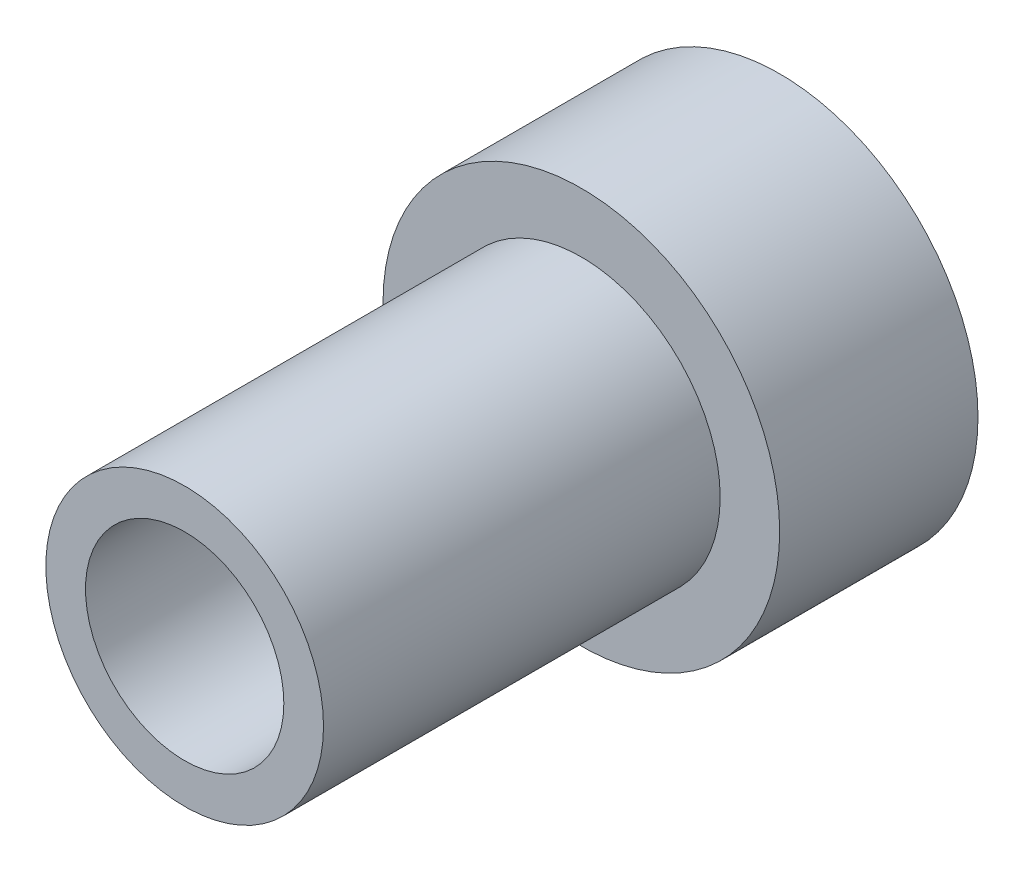
ISO-10303-21;
HEADER;
FILE_DESCRIPTION(('STEP AP214'),'2;1');
FILE_NAME('part.step','',(''),(''),'','','');
FILE_SCHEMA(('AUTOMOTIVE_DESIGN { 1 0 10303 214 1 1 1 1 }'));
ENDSEC;
DATA;
#1=APPLICATION_CONTEXT('core data for automotive mechanical design processes');
#2=APPLICATION_PROTOCOL_DEFINITION('international standard','automotive_design',2000,#1);
#3=PRODUCT_CONTEXT('',#1,'mechanical');
#4=PRODUCT('Part','Part','',(#3));
#5=PRODUCT_RELATED_PRODUCT_CATEGORY('part','',(#4));
#6=PRODUCT_DEFINITION_FORMATION('','',#4);
#7=PRODUCT_DEFINITION_CONTEXT('part definition',#1,'design');
#8=PRODUCT_DEFINITION('design','',#6,#7);
#9=PRODUCT_DEFINITION_SHAPE('','',#8);
#10=(LENGTH_UNIT() NAMED_UNIT(*) SI_UNIT(.MILLI.,.METRE.));
#11=(NAMED_UNIT(*) PLANE_ANGLE_UNIT() SI_UNIT($,.RADIAN.));
#12=(NAMED_UNIT(*) SI_UNIT($,.STERADIAN.) SOLID_ANGLE_UNIT());
#13=UNCERTAINTY_MEASURE_WITH_UNIT(LENGTH_MEASURE(1.E-05),#10,'distance_accuracy_value','');
#14=(GEOMETRIC_REPRESENTATION_CONTEXT(3) GLOBAL_UNCERTAINTY_ASSIGNED_CONTEXT((#13)) GLOBAL_UNIT_ASSIGNED_CONTEXT((#10,
#11,#12)) REPRESENTATION_CONTEXT('',''));
#15=CARTESIAN_POINT('',(0.,0.,0.));
#16=DIRECTION('',(0.,0.,1.));
#17=DIRECTION('',(1.,0.,0.));
#18=AXIS2_PLACEMENT_3D('',#15,#16,#17);
#19=CARTESIAN_POINT('',(0.,0.,5.));
#20=DIRECTION('',(0.,0.,-1.));
#21=DIRECTION('',(-1.,0.,0.));
#22=AXIS2_PLACEMENT_3D('',#19,#20,#21);
#23=CYLINDRICAL_SURFACE('',#22,5.);
#24=CARTESIAN_POINT('',(0.,0.,5.));
#25=DIRECTION('',(0.,0.,1.));
#26=DIRECTION('',(1.,0.,0.));
#27=AXIS2_PLACEMENT_3D('',#24,#25,#26);
#28=CIRCLE('',#27,5.);
#29=CARTESIAN_POINT('',(5.,0.,5.));
#30=VERTEX_POINT('',#29);
#31=EDGE_CURVE('E10',#30,#30,#28,.T.);
#32=ORIENTED_EDGE('',*,*,#31,.F.);
#33=EDGE_LOOP('',(#32));
#34=FACE_BOUND('',#33,.T.);
#35=CARTESIAN_POINT('',(0.,0.,0.));
#36=DIRECTION('',(0.,0.,1.));
#37=DIRECTION('',(1.,0.,0.));
#38=AXIS2_PLACEMENT_3D('',#35,#36,#37);
#39=CIRCLE('',#38,5.);
#40=CARTESIAN_POINT('',(5.,0.,0.));
#41=VERTEX_POINT('',#40);
#42=EDGE_CURVE('E34',#41,#41,#39,.T.);
#43=ORIENTED_EDGE('',*,*,#42,.T.);
#44=EDGE_LOOP('',(#43));
#45=FACE_BOUND('',#44,.T.);
#46=ADVANCED_FACE('F31',(#34,#45),#23,.T.);
#47=CARTESIAN_POINT('',(0.,0.,5.));
#48=DIRECTION('',(0.,0.,1.));
#49=DIRECTION('',(1.,0.,0.));
#50=AXIS2_PLACEMENT_3D('',#47,#48,#49);
#51=PLANE('',#50);
#52=CARTESIAN_POINT('',(0.,0.,5.));
#53=DIRECTION('',(0.,0.,1.));
#54=DIRECTION('',(1.,0.,0.));
#55=AXIS2_PLACEMENT_3D('',#52,#53,#54);
#56=CIRCLE('',#55,3.5);
#57=CARTESIAN_POINT('',(3.5,0.,5.));
#58=VERTEX_POINT('',#57);
#59=EDGE_CURVE('E43',#58,#58,#56,.T.);
#60=ORIENTED_EDGE('',*,*,#59,.F.);
#61=EDGE_LOOP('',(#60));
#62=FACE_BOUND('',#61,.T.);
#63=ORIENTED_EDGE('',*,*,#31,.T.);
#64=EDGE_LOOP('',(#63));
#65=FACE_BOUND('',#64,.T.);
#66=ADVANCED_FACE('F76',(#62,#65),#51,.T.);
#67=CARTESIAN_POINT('',(0.,0.,0.));
#68=DIRECTION('',(0.,0.,1.));
#69=DIRECTION('',(1.,0.,0.));
#70=AXIS2_PLACEMENT_3D('',#67,#68,#69);
#71=PLANE('',#70);
#72=CARTESIAN_POINT('',(0.,0.,0.));
#73=DIRECTION('',(0.,0.,1.));
#74=DIRECTION('',(1.,0.,0.));
#75=AXIS2_PLACEMENT_3D('',#72,#73,#74);
#76=CIRCLE('',#75,2.5);
#77=CARTESIAN_POINT('',(2.5,0.,0.));
#78=VERTEX_POINT('',#77);
#79=EDGE_CURVE('E46',#78,#78,#76,.T.);
#80=ORIENTED_EDGE('',*,*,#79,.T.);
#81=EDGE_LOOP('',(#80));
#82=FACE_BOUND('',#81,.T.);
#83=ORIENTED_EDGE('',*,*,#42,.F.);
#84=EDGE_LOOP('',(#83));
#85=FACE_BOUND('',#84,.T.);
#86=ADVANCED_FACE('F55',(#82,#85),#71,.F.);
#87=CARTESIAN_POINT('',(0.,0.,15.));
#88=DIRECTION('',(0.,0.,-1.));
#89=DIRECTION('',(-1.,0.,0.));
#90=AXIS2_PLACEMENT_3D('',#87,#88,#89);
#91=CYLINDRICAL_SURFACE('',#90,3.5);
#92=CARTESIAN_POINT('',(0.,0.,15.));
#93=DIRECTION('',(0.,0.,1.));
#94=DIRECTION('',(1.,0.,0.));
#95=AXIS2_PLACEMENT_3D('',#92,#93,#94);
#96=CIRCLE('',#95,3.5);
#97=CARTESIAN_POINT('',(3.5,0.,15.));
#98=VERTEX_POINT('',#97);
#99=EDGE_CURVE('E41',#98,#98,#96,.T.);
#100=ORIENTED_EDGE('',*,*,#99,.F.);
#101=EDGE_LOOP('',(#100));
#102=FACE_BOUND('',#101,.T.);
#103=ORIENTED_EDGE('',*,*,#59,.T.);
#104=EDGE_LOOP('',(#103));
#105=FACE_BOUND('',#104,.T.);
#106=ADVANCED_FACE('F67',(#102,#105),#91,.T.);
#107=CARTESIAN_POINT('',(0.,0.,15.));
#108=DIRECTION('',(0.,0.,1.));
#109=DIRECTION('',(1.,0.,0.));
#110=AXIS2_PLACEMENT_3D('',#107,#108,#109);
#111=PLANE('',#110);
#112=CARTESIAN_POINT('',(0.,0.,15.));
#113=DIRECTION('',(0.,0.,1.));
#114=DIRECTION('',(1.,0.,0.));
#115=AXIS2_PLACEMENT_3D('',#112,#113,#114);
#116=CIRCLE('',#115,2.5);
#117=CARTESIAN_POINT('',(2.5,0.,15.));
#118=VERTEX_POINT('',#117);
#119=EDGE_CURVE('E49',#118,#118,#116,.T.);
#120=ORIENTED_EDGE('',*,*,#119,.F.);
#121=EDGE_LOOP('',(#120));
#122=FACE_BOUND('',#121,.T.);
#123=ORIENTED_EDGE('',*,*,#99,.T.);
#124=EDGE_LOOP('',(#123));
#125=FACE_BOUND('',#124,.T.);
#126=ADVANCED_FACE('F61',(#122,#125),#111,.T.);
#127=CARTESIAN_POINT('',(0.,0.,0.));
#128=DIRECTION('',(0.,0.,1.));
#129=DIRECTION('',(1.,0.,0.));
#130=AXIS2_PLACEMENT_3D('',#127,#128,#129);
#131=CYLINDRICAL_SURFACE('',#130,2.5);
#132=ORIENTED_EDGE('',*,*,#79,.F.);
#133=EDGE_LOOP('',(#132));
#134=FACE_BOUND('',#133,.T.);
#135=ORIENTED_EDGE('',*,*,#119,.T.);
#136=EDGE_LOOP('',(#135));
#137=FACE_BOUND('',#136,.T.);
#138=ADVANCED_FACE('F58',(#134,#137),#131,.F.);
#139=CLOSED_SHELL('',(#46,#66,#86,#106,#126,#138));
#140=MANIFOLD_SOLID_BREP('B2',#139);
#141=ADVANCED_BREP_SHAPE_REPRESENTATION('',(#18,#140),#14);
#142=SHAPE_DEFINITION_REPRESENTATION(#9,#141);
ENDSEC;
END-ISO-10303-21;
